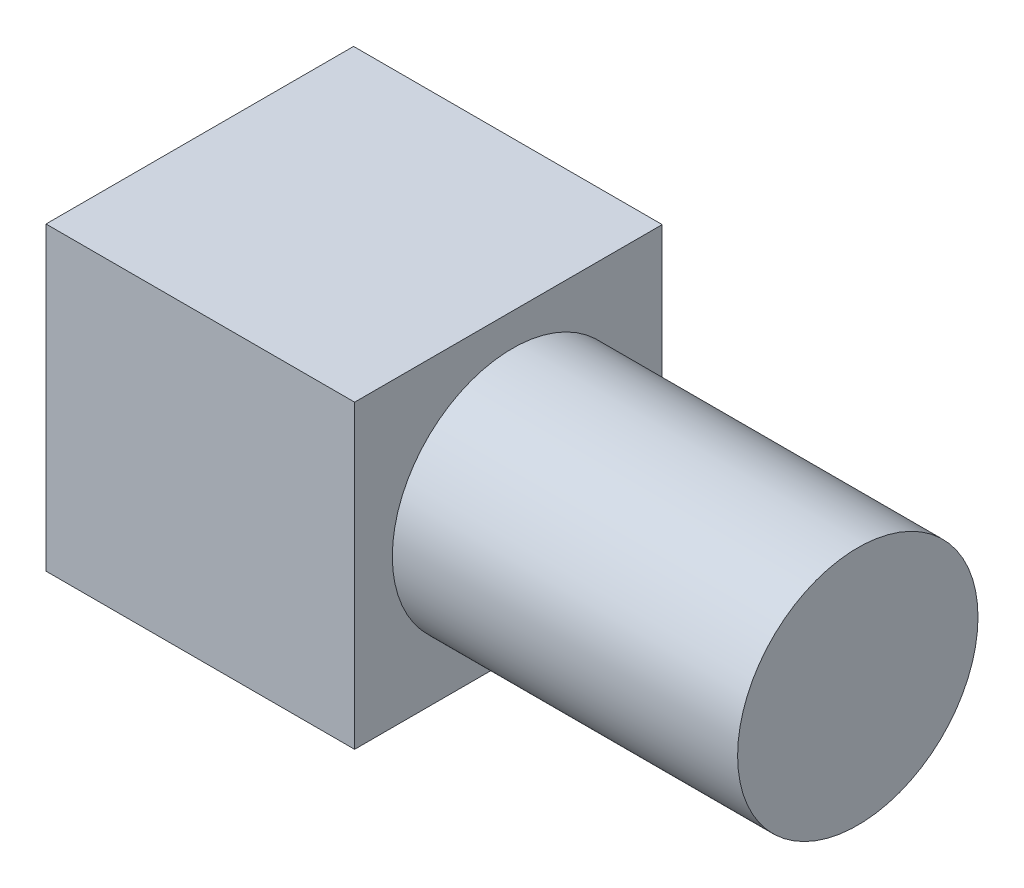
ISO-10303-21;
HEADER;
FILE_DESCRIPTION(('STEP AP214'),'2;1');
FILE_NAME('part.step','',(''),(''),'','','');
FILE_SCHEMA(('AUTOMOTIVE_DESIGN { 1 0 10303 214 1 1 1 1 }'));
ENDSEC;
DATA;
#1=APPLICATION_CONTEXT('core data for automotive mechanical design processes');
#2=APPLICATION_PROTOCOL_DEFINITION('international standard','automotive_design',2000,#1);
#3=PRODUCT_CONTEXT('',#1,'mechanical');
#4=PRODUCT('Part','Part','',(#3));
#5=PRODUCT_RELATED_PRODUCT_CATEGORY('part','',(#4));
#6=PRODUCT_DEFINITION_FORMATION('','',#4);
#7=PRODUCT_DEFINITION_CONTEXT('part definition',#1,'design');
#8=PRODUCT_DEFINITION('design','',#6,#7);
#9=PRODUCT_DEFINITION_SHAPE('','',#8);
#10=(LENGTH_UNIT() NAMED_UNIT(*) SI_UNIT(.MILLI.,.METRE.));
#11=(NAMED_UNIT(*) PLANE_ANGLE_UNIT() SI_UNIT($,.RADIAN.));
#12=(NAMED_UNIT(*) SI_UNIT($,.STERADIAN.) SOLID_ANGLE_UNIT());
#13=UNCERTAINTY_MEASURE_WITH_UNIT(LENGTH_MEASURE(1.E-05),#10,'distance_accuracy_value','');
#14=(GEOMETRIC_REPRESENTATION_CONTEXT(3) GLOBAL_UNCERTAINTY_ASSIGNED_CONTEXT((#13)) GLOBAL_UNIT_ASSIGNED_CONTEXT((#10,
#11,#12)) REPRESENTATION_CONTEXT('',''));
#15=CARTESIAN_POINT('',(0.,0.,0.));
#16=DIRECTION('',(0.,0.,1.));
#17=DIRECTION('',(1.,0.,0.));
#18=AXIS2_PLACEMENT_3D('',#15,#16,#17);
#19=CARTESIAN_POINT('',(-1.96324773155608,42.9171905799358,6.35983970894724));
#20=DIRECTION('',(1.,0.,0.));
#21=DIRECTION('',(0.,0.,-1.));
#22=AXIS2_PLACEMENT_3D('',#19,#20,#21);
#23=PLANE('',#22);
#24=DIRECTION('',(0.,0.,1.));
#25=VECTOR('',#24,1.);
#26=CARTESIAN_POINT('',(-1.96324773155608,29.7771905799358,6.35983970894724));
#27=LINE('',#26,#25);
#28=CARTESIAN_POINT('',(-1.96324773155608,29.7771905799358,6.35983970894724));
#29=VERTEX_POINT('',#28);
#30=CARTESIAN_POINT('',(-1.96324773155608,29.7771905799358,19.8013727923495));
#31=VERTEX_POINT('',#30);
#32=EDGE_CURVE('E110',#29,#31,#27,.T.);
#33=ORIENTED_EDGE('',*,*,#32,.T.);
#34=DIRECTION('',(0.,-1.,0.));
#35=VECTOR('',#34,1.);
#36=CARTESIAN_POINT('',(-1.96324773155608,42.9171905799358,19.8013727923495));
#37=LINE('',#36,#35);
#38=CARTESIAN_POINT('',(-1.96324773155608,42.9171905799358,19.8013727923495));
#39=VERTEX_POINT('',#38);
#40=EDGE_CURVE('E47',#39,#31,#37,.T.);
#41=ORIENTED_EDGE('',*,*,#40,.F.);
#42=DIRECTION('',(0.,0.,1.));
#43=VECTOR('',#42,1.);
#44=CARTESIAN_POINT('',(-1.96324773155608,42.9171905799358,6.35983970894724));
#45=LINE('',#44,#43);
#46=CARTESIAN_POINT('',(-1.96324773155608,42.9171905799358,6.35983970894724));
#47=VERTEX_POINT('',#46);
#48=EDGE_CURVE('E91',#47,#39,#45,.T.);
#49=ORIENTED_EDGE('',*,*,#48,.F.);
#50=DIRECTION('',(0.,-1.,0.));
#51=VECTOR('',#50,1.);
#52=CARTESIAN_POINT('',(-1.96324773155608,42.9171905799358,6.35983970894724));
#53=LINE('',#52,#51);
#54=EDGE_CURVE('E106',#47,#29,#53,.T.);
#55=ORIENTED_EDGE('',*,*,#54,.T.);
#56=EDGE_LOOP('',(#33,#41,#49,#55));
#57=FACE_BOUND('',#56,.T.);
#58=ADVANCED_FACE('F38',(#57),#23,.F.);
#59=CARTESIAN_POINT('',(-1.96324773155608,42.9171905799358,19.8013727923495));
#60=DIRECTION('',(0.,0.,-1.));
#61=DIRECTION('',(-1.,0.,0.));
#62=AXIS2_PLACEMENT_3D('',#59,#60,#61);
#63=PLANE('',#62);
#64=DIRECTION('',(1.,0.,0.));
#65=VECTOR('',#64,1.);
#66=CARTESIAN_POINT('',(-1.96324773155608,29.7771905799358,19.8013727923495));
#67=LINE('',#66,#65);
#68=CARTESIAN_POINT('',(11.5236959365875,29.7771905799358,19.8013727923495));
#69=VERTEX_POINT('',#68);
#70=EDGE_CURVE('E97',#31,#69,#67,.T.);
#71=ORIENTED_EDGE('',*,*,#70,.T.);
#72=DIRECTION('',(0.,-1.,0.));
#73=VECTOR('',#72,1.);
#74=CARTESIAN_POINT('',(11.5236959365875,42.9171905799358,19.8013727923495));
#75=LINE('',#74,#73);
#76=CARTESIAN_POINT('',(11.5236959365875,42.9171905799358,19.8013727923495));
#77=VERTEX_POINT('',#76);
#78=EDGE_CURVE('E95',#77,#69,#75,.T.);
#79=ORIENTED_EDGE('',*,*,#78,.F.);
#80=DIRECTION('',(1.,0.,0.));
#81=VECTOR('',#80,1.);
#82=CARTESIAN_POINT('',(-1.96324773155608,42.9171905799358,19.8013727923495));
#83=LINE('',#82,#81);
#84=EDGE_CURVE('E86',#39,#77,#83,.T.);
#85=ORIENTED_EDGE('',*,*,#84,.F.);
#86=ORIENTED_EDGE('',*,*,#40,.T.);
#87=EDGE_LOOP('',(#71,#79,#85,#86));
#88=FACE_BOUND('',#87,.T.);
#89=ADVANCED_FACE('F96',(#88),#63,.F.);
#90=CARTESIAN_POINT('',(11.5236959365875,42.9171905799358,6.35983970894724));
#91=DIRECTION('',(-1.,0.,0.));
#92=DIRECTION('',(0.,0.,1.));
#93=AXIS2_PLACEMENT_3D('',#90,#91,#92);
#94=PLANE('',#93);
#95=CARTESIAN_POINT('',(11.5236959365875,36.252554063744,12.9008276822925));
#96=DIRECTION('',(-1.,0.,0.));
#97=DIRECTION('',(0.,0.,1.));
#98=AXIS2_PLACEMENT_3D('',#95,#96,#97);
#99=CIRCLE('',#98,5.25273330628023);
#100=CARTESIAN_POINT('',(11.5236959365875,36.252554063744,18.1535609885727));
#101=VERTEX_POINT('',#100);
#102=EDGE_CURVE('E11',#101,#101,#99,.F.);
#103=ORIENTED_EDGE('',*,*,#102,.F.);
#104=EDGE_LOOP('',(#103));
#105=FACE_BOUND('',#104,.T.);
#106=DIRECTION('',(0.,0.,-1.));
#107=VECTOR('',#106,1.);
#108=CARTESIAN_POINT('',(11.5236959365875,29.7771905799358,6.35983970894724));
#109=LINE('',#108,#107);
#110=CARTESIAN_POINT('',(11.5236959365875,29.7771905799358,6.35983970894724));
#111=VERTEX_POINT('',#110);
#112=EDGE_CURVE('E72',#69,#111,#109,.T.);
#113=ORIENTED_EDGE('',*,*,#112,.T.);
#114=DIRECTION('',(0.,-1.,0.));
#115=VECTOR('',#114,1.);
#116=CARTESIAN_POINT('',(11.5236959365875,42.9171905799358,6.35983970894724));
#117=LINE('',#116,#115);
#118=CARTESIAN_POINT('',(11.5236959365875,42.9171905799358,6.35983970894724));
#119=VERTEX_POINT('',#118);
#120=EDGE_CURVE('E99',#119,#111,#117,.T.);
#121=ORIENTED_EDGE('',*,*,#120,.F.);
#122=DIRECTION('',(0.,0.,-1.));
#123=VECTOR('',#122,1.);
#124=CARTESIAN_POINT('',(11.5236959365875,42.9171905799358,6.35983970894724));
#125=LINE('',#124,#123);
#126=EDGE_CURVE('E89',#77,#119,#125,.T.);
#127=ORIENTED_EDGE('',*,*,#126,.F.);
#128=ORIENTED_EDGE('',*,*,#78,.T.);
#129=EDGE_LOOP('',(#113,#121,#127,#128));
#130=FACE_BOUND('',#129,.T.);
#131=ADVANCED_FACE('F101',(#105,#130),#94,.F.);
#132=CARTESIAN_POINT('',(-1.96324773155608,42.9171905799358,6.35983970894724));
#133=DIRECTION('',(0.,0.,1.));
#134=DIRECTION('',(1.,0.,0.));
#135=AXIS2_PLACEMENT_3D('',#132,#133,#134);
#136=PLANE('',#135);
#137=DIRECTION('',(-1.,0.,0.));
#138=VECTOR('',#137,1.);
#139=CARTESIAN_POINT('',(-1.96324773155608,29.7771905799358,6.35983970894724));
#140=LINE('',#139,#138);
#141=EDGE_CURVE('E78',#111,#29,#140,.T.);
#142=ORIENTED_EDGE('',*,*,#141,.T.);
#143=ORIENTED_EDGE('',*,*,#54,.F.);
#144=DIRECTION('',(-1.,0.,0.));
#145=VECTOR('',#144,1.);
#146=CARTESIAN_POINT('',(-1.96324773155608,42.9171905799358,6.35983970894724));
#147=LINE('',#146,#145);
#148=EDGE_CURVE('E55',#119,#47,#147,.T.);
#149=ORIENTED_EDGE('',*,*,#148,.F.);
#150=ORIENTED_EDGE('',*,*,#120,.T.);
#151=EDGE_LOOP('',(#142,#143,#149,#150));
#152=FACE_BOUND('',#151,.T.);
#153=ADVANCED_FACE('F138',(#152),#136,.F.);
#154=CARTESIAN_POINT('',(8.07249149625442,42.9171905799358,10.6738452593635));
#155=DIRECTION('',(0.,1.,0.));
#156=DIRECTION('',(0.,0.,1.));
#157=AXIS2_PLACEMENT_3D('',#154,#155,#156);
#158=PLANE('',#157);
#159=ORIENTED_EDGE('',*,*,#48,.T.);
#160=ORIENTED_EDGE('',*,*,#84,.T.);
#161=ORIENTED_EDGE('',*,*,#126,.T.);
#162=ORIENTED_EDGE('',*,*,#148,.T.);
#163=EDGE_LOOP('',(#159,#160,#161,#162));
#164=FACE_BOUND('',#163,.T.);
#165=ADVANCED_FACE('F87',(#164),#158,.T.);
#166=CARTESIAN_POINT('',(8.07249149625442,29.7771905799358,10.6738452593635));
#167=DIRECTION('',(0.,1.,0.));
#168=DIRECTION('',(0.,0.,1.));
#169=AXIS2_PLACEMENT_3D('',#166,#167,#168);
#170=PLANE('',#169);
#171=ORIENTED_EDGE('',*,*,#32,.F.);
#172=ORIENTED_EDGE('',*,*,#141,.F.);
#173=ORIENTED_EDGE('',*,*,#112,.F.);
#174=ORIENTED_EDGE('',*,*,#70,.F.);
#175=EDGE_LOOP('',(#171,#172,#173,#174));
#176=FACE_BOUND('',#175,.T.);
#177=ADVANCED_FACE('F127',(#176),#170,.F.);
#178=CARTESIAN_POINT('',(26.6124914962544,36.252554063744,12.9008276822925));
#179=DIRECTION('',(-1.,0.,0.));
#180=DIRECTION('',(0.,0.,1.));
#181=AXIS2_PLACEMENT_3D('',#178,#179,#180);
#182=CYLINDRICAL_SURFACE('',#181,5.25273330628023);
#183=CARTESIAN_POINT('',(26.6124914962544,36.252554063744,12.9008276822925));
#184=DIRECTION('',(1.,0.,0.));
#185=DIRECTION('',(0.,0.,-1.));
#186=AXIS2_PLACEMENT_3D('',#183,#184,#185);
#187=CIRCLE('',#186,5.25273330628023);
#188=CARTESIAN_POINT('',(26.6124914962544,36.252554063744,7.64809437601226));
#189=VERTEX_POINT('',#188);
#190=EDGE_CURVE('E114',#189,#189,#187,.T.);
#191=ORIENTED_EDGE('',*,*,#190,.F.);
#192=EDGE_LOOP('',(#191));
#193=FACE_BOUND('',#192,.T.);
#194=ORIENTED_EDGE('',*,*,#102,.T.);
#195=EDGE_LOOP('',(#194));
#196=FACE_BOUND('',#195,.T.);
#197=ADVANCED_FACE('F129',(#193,#196),#182,.T.);
#198=CARTESIAN_POINT('',(26.6124914962544,36.252554063744,12.9008276822925));
#199=DIRECTION('',(1.,0.,0.));
#200=DIRECTION('',(0.,0.,-1.));
#201=AXIS2_PLACEMENT_3D('',#198,#199,#200);
#202=PLANE('',#201);
#203=ORIENTED_EDGE('',*,*,#190,.T.);
#204=EDGE_LOOP('',(#203));
#205=FACE_BOUND('',#204,.T.);
#206=ADVANCED_FACE('F135',(#205),#202,.T.);
#207=CLOSED_SHELL('',(#58,#89,#131,#153,#165,#177,#197,#206));
#208=MANIFOLD_SOLID_BREP('B2',#207);
#209=ADVANCED_BREP_SHAPE_REPRESENTATION('',(#18,#208),#14);
#210=SHAPE_DEFINITION_REPRESENTATION(#9,#209);
ENDSEC;
END-ISO-10303-21;
